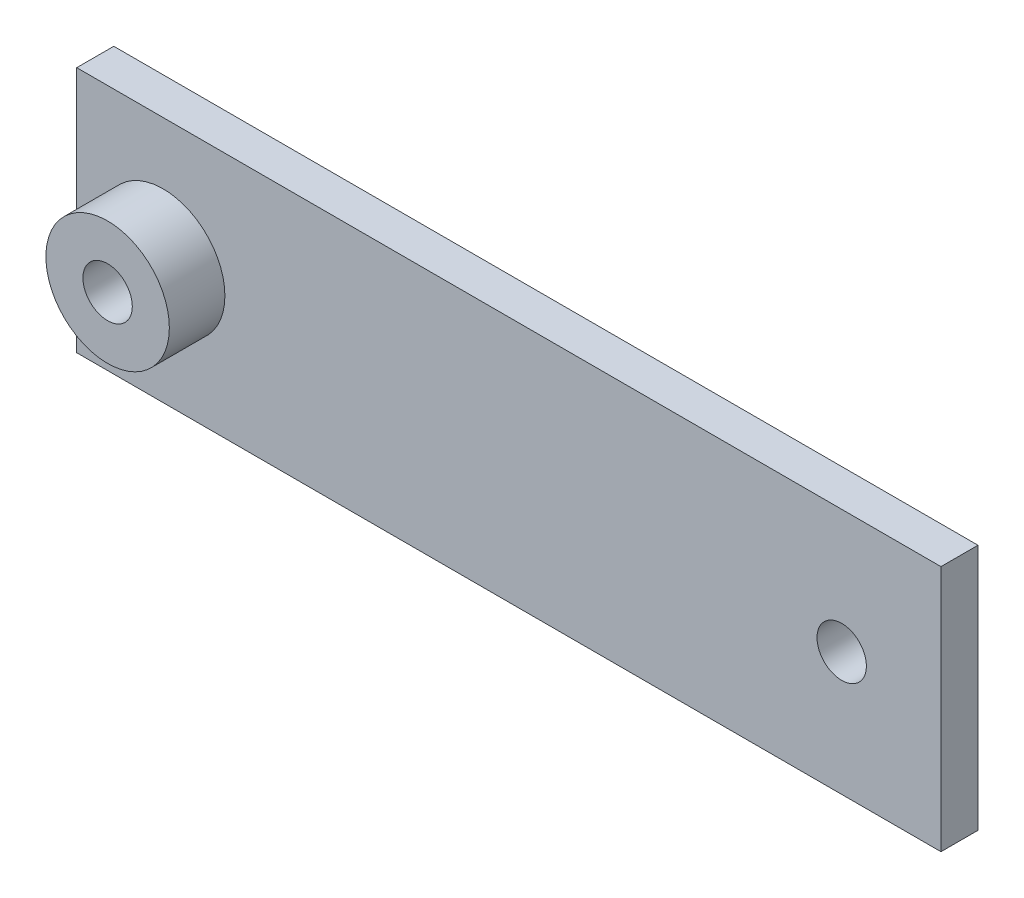
ISO-10303-21;
HEADER;
FILE_DESCRIPTION(('STEP AP214'),'2;1');
FILE_NAME('part.step','',(''),(''),'','','');
FILE_SCHEMA(('AUTOMOTIVE_DESIGN { 1 0 10303 214 1 1 1 1 }'));
ENDSEC;
DATA;
#1=APPLICATION_CONTEXT('core data for automotive mechanical design processes');
#2=APPLICATION_PROTOCOL_DEFINITION('international standard','automotive_design',2000,#1);
#3=PRODUCT_CONTEXT('',#1,'mechanical');
#4=PRODUCT('Part','Part','',(#3));
#5=PRODUCT_RELATED_PRODUCT_CATEGORY('part','',(#4));
#6=PRODUCT_DEFINITION_FORMATION('','',#4);
#7=PRODUCT_DEFINITION_CONTEXT('part definition',#1,'design');
#8=PRODUCT_DEFINITION('design','',#6,#7);
#9=PRODUCT_DEFINITION_SHAPE('','',#8);
#10=(LENGTH_UNIT() NAMED_UNIT(*) SI_UNIT(.MILLI.,.METRE.));
#11=(NAMED_UNIT(*) PLANE_ANGLE_UNIT() SI_UNIT($,.RADIAN.));
#12=(NAMED_UNIT(*) SI_UNIT($,.STERADIAN.) SOLID_ANGLE_UNIT());
#13=UNCERTAINTY_MEASURE_WITH_UNIT(LENGTH_MEASURE(1.E-05),#10,'distance_accuracy_value','');
#14=(GEOMETRIC_REPRESENTATION_CONTEXT(3) GLOBAL_UNCERTAINTY_ASSIGNED_CONTEXT((#13)) GLOBAL_UNIT_ASSIGNED_CONTEXT((#10,
#11,#12)) REPRESENTATION_CONTEXT('',''));
#15=CARTESIAN_POINT('',(0.,0.,0.));
#16=DIRECTION('',(0.,0.,1.));
#17=DIRECTION('',(1.,0.,0.));
#18=AXIS2_PLACEMENT_3D('',#15,#16,#17);
#19=CARTESIAN_POINT('',(35.,10.,3.));
#20=DIRECTION('',(-1.,0.,0.));
#21=DIRECTION('',(0.,0.,1.));
#22=AXIS2_PLACEMENT_3D('',#19,#20,#21);
#23=PLANE('',#22);
#24=DIRECTION('',(0.,1.,0.));
#25=VECTOR('',#24,1.);
#26=CARTESIAN_POINT('',(35.,10.,0.));
#27=LINE('',#26,#25);
#28=CARTESIAN_POINT('',(35.,-10.,0.));
#29=VERTEX_POINT('',#28);
#30=CARTESIAN_POINT('',(35.,10.,0.));
#31=VERTEX_POINT('',#30);
#32=EDGE_CURVE('E97',#29,#31,#27,.T.);
#33=ORIENTED_EDGE('',*,*,#32,.T.);
#34=DIRECTION('',(0.,0.,-1.));
#35=VECTOR('',#34,1.);
#36=CARTESIAN_POINT('',(35.,10.,3.));
#37=LINE('',#36,#35);
#38=CARTESIAN_POINT('',(35.,10.,3.));
#39=VERTEX_POINT('',#38);
#40=EDGE_CURVE('E11',#39,#31,#37,.T.);
#41=ORIENTED_EDGE('',*,*,#40,.F.);
#42=DIRECTION('',(0.,1.,0.));
#43=VECTOR('',#42,1.);
#44=CARTESIAN_POINT('',(35.,10.,3.));
#45=LINE('',#44,#43);
#46=CARTESIAN_POINT('',(35.,-10.,3.));
#47=VERTEX_POINT('',#46);
#48=EDGE_CURVE('E85',#47,#39,#45,.T.);
#49=ORIENTED_EDGE('',*,*,#48,.F.);
#50=DIRECTION('',(0.,0.,-1.));
#51=VECTOR('',#50,1.);
#52=CARTESIAN_POINT('',(35.,-10.,3.));
#53=LINE('',#52,#51);
#54=EDGE_CURVE('E93',#47,#29,#53,.T.);
#55=ORIENTED_EDGE('',*,*,#54,.T.);
#56=EDGE_LOOP('',(#33,#41,#49,#55));
#57=FACE_BOUND('',#56,.T.);
#58=ADVANCED_FACE('F34',(#57),#23,.F.);
#59=CARTESIAN_POINT('',(-35.,10.,3.));
#60=DIRECTION('',(0.,-1.,0.));
#61=DIRECTION('',(0.,0.,-1.));
#62=AXIS2_PLACEMENT_3D('',#59,#60,#61);
#63=PLANE('',#62);
#64=DIRECTION('',(-1.,0.,0.));
#65=VECTOR('',#64,1.);
#66=CARTESIAN_POINT('',(-35.,10.,0.));
#67=LINE('',#66,#65);
#68=CARTESIAN_POINT('',(-35.,10.,0.));
#69=VERTEX_POINT('',#68);
#70=EDGE_CURVE('E89',#31,#69,#67,.T.);
#71=ORIENTED_EDGE('',*,*,#70,.T.);
#72=DIRECTION('',(0.,0.,-1.));
#73=VECTOR('',#72,1.);
#74=CARTESIAN_POINT('',(-35.,10.,3.));
#75=LINE('',#74,#73);
#76=CARTESIAN_POINT('',(-35.,10.,3.));
#77=VERTEX_POINT('',#76);
#78=EDGE_CURVE('E42',#77,#69,#75,.T.);
#79=ORIENTED_EDGE('',*,*,#78,.F.);
#80=DIRECTION('',(-1.,0.,0.));
#81=VECTOR('',#80,1.);
#82=CARTESIAN_POINT('',(-35.,10.,3.));
#83=LINE('',#82,#81);
#84=EDGE_CURVE('E80',#39,#77,#83,.T.);
#85=ORIENTED_EDGE('',*,*,#84,.F.);
#86=ORIENTED_EDGE('',*,*,#40,.T.);
#87=EDGE_LOOP('',(#71,#79,#85,#86));
#88=FACE_BOUND('',#87,.T.);
#89=ADVANCED_FACE('F88',(#88),#63,.F.);
#90=CARTESIAN_POINT('',(-35.,10.,3.));
#91=DIRECTION('',(1.,0.,0.));
#92=DIRECTION('',(0.,0.,-1.));
#93=AXIS2_PLACEMENT_3D('',#90,#91,#92);
#94=PLANE('',#93);
#95=DIRECTION('',(0.,-1.,0.));
#96=VECTOR('',#95,1.);
#97=CARTESIAN_POINT('',(-35.,10.,0.));
#98=LINE('',#97,#96);
#99=CARTESIAN_POINT('',(-35.,-10.,0.));
#100=VERTEX_POINT('',#99);
#101=EDGE_CURVE('E67',#69,#100,#98,.T.);
#102=ORIENTED_EDGE('',*,*,#101,.T.);
#103=DIRECTION('',(0.,0.,-1.));
#104=VECTOR('',#103,1.);
#105=CARTESIAN_POINT('',(-35.,-10.,3.));
#106=LINE('',#105,#104);
#107=CARTESIAN_POINT('',(-35.,-10.,3.));
#108=VERTEX_POINT('',#107);
#109=EDGE_CURVE('E90',#108,#100,#106,.T.);
#110=ORIENTED_EDGE('',*,*,#109,.F.);
#111=DIRECTION('',(0.,-1.,0.));
#112=VECTOR('',#111,1.);
#113=CARTESIAN_POINT('',(-35.,10.,3.));
#114=LINE('',#113,#112);
#115=EDGE_CURVE('E83',#77,#108,#114,.T.);
#116=ORIENTED_EDGE('',*,*,#115,.F.);
#117=ORIENTED_EDGE('',*,*,#78,.T.);
#118=EDGE_LOOP('',(#102,#110,#116,#117));
#119=FACE_BOUND('',#118,.T.);
#120=ADVANCED_FACE('F91',(#119),#94,.F.);
#121=CARTESIAN_POINT('',(-35.,-10.,3.));
#122=DIRECTION('',(0.,1.,0.));
#123=DIRECTION('',(0.,0.,1.));
#124=AXIS2_PLACEMENT_3D('',#121,#122,#123);
#125=PLANE('',#124);
#126=DIRECTION('',(1.,0.,0.));
#127=VECTOR('',#126,1.);
#128=CARTESIAN_POINT('',(-35.,-10.,0.));
#129=LINE('',#128,#127);
#130=EDGE_CURVE('E73',#100,#29,#129,.T.);
#131=ORIENTED_EDGE('',*,*,#130,.T.);
#132=ORIENTED_EDGE('',*,*,#54,.F.);
#133=DIRECTION('',(1.,0.,0.));
#134=VECTOR('',#133,1.);
#135=CARTESIAN_POINT('',(-35.,-10.,3.));
#136=LINE('',#135,#134);
#137=EDGE_CURVE('E50',#108,#47,#136,.T.);
#138=ORIENTED_EDGE('',*,*,#137,.F.);
#139=ORIENTED_EDGE('',*,*,#109,.T.);
#140=EDGE_LOOP('',(#131,#132,#138,#139));
#141=FACE_BOUND('',#140,.T.);
#142=ADVANCED_FACE('F105',(#141),#125,.F.);
#143=CARTESIAN_POINT('',(0.,0.,3.));
#144=DIRECTION('',(0.,0.,1.));
#145=DIRECTION('',(1.,0.,0.));
#146=AXIS2_PLACEMENT_3D('',#143,#144,#145);
#147=PLANE('',#146);
#148=CARTESIAN_POINT('',(-28.,0.,3.));
#149=DIRECTION('',(0.,0.,1.));
#150=DIRECTION('',(1.,0.,0.));
#151=AXIS2_PLACEMENT_3D('',#148,#149,#150);
#152=CIRCLE('',#151,5.);
#153=CARTESIAN_POINT('',(-23.,0.,3.));
#154=VERTEX_POINT('',#153);
#155=EDGE_CURVE('E120',#154,#154,#152,.T.);
#156=ORIENTED_EDGE('',*,*,#155,.F.);
#157=EDGE_LOOP('',(#156));
#158=FACE_BOUND('',#157,.T.);
#159=CARTESIAN_POINT('',(26.96,0.,3.));
#160=DIRECTION('',(0.,0.,1.));
#161=DIRECTION('',(1.,0.,0.));
#162=AXIS2_PLACEMENT_3D('',#159,#160,#161);
#163=CIRCLE('',#162,2.);
#164=CARTESIAN_POINT('',(28.96,0.,3.));
#165=VERTEX_POINT('',#164);
#166=EDGE_CURVE('E111',#165,#165,#163,.T.);
#167=ORIENTED_EDGE('',*,*,#166,.F.);
#168=EDGE_LOOP('',(#167));
#169=FACE_BOUND('',#168,.T.);
#170=ORIENTED_EDGE('',*,*,#48,.T.);
#171=ORIENTED_EDGE('',*,*,#84,.T.);
#172=ORIENTED_EDGE('',*,*,#115,.T.);
#173=ORIENTED_EDGE('',*,*,#137,.T.);
#174=EDGE_LOOP('',(#170,#171,#172,#173));
#175=FACE_BOUND('',#174,.T.);
#176=ADVANCED_FACE('F81',(#158,#169,#175),#147,.T.);
#177=CARTESIAN_POINT('',(0.,0.,0.));
#178=DIRECTION('',(0.,0.,1.));
#179=DIRECTION('',(1.,0.,0.));
#180=AXIS2_PLACEMENT_3D('',#177,#178,#179);
#181=PLANE('',#180);
#182=CARTESIAN_POINT('',(-28.,0.,0.));
#183=DIRECTION('',(0.,0.,1.));
#184=DIRECTION('',(1.,0.,0.));
#185=AXIS2_PLACEMENT_3D('',#182,#183,#184);
#186=CIRCLE('',#185,2.);
#187=CARTESIAN_POINT('',(-26.,0.,0.));
#188=VERTEX_POINT('',#187);
#189=EDGE_CURVE('E100',#188,#188,#186,.T.);
#190=ORIENTED_EDGE('',*,*,#189,.T.);
#191=EDGE_LOOP('',(#190));
#192=FACE_BOUND('',#191,.T.);
#193=CARTESIAN_POINT('',(26.96,0.,0.));
#194=DIRECTION('',(0.,0.,1.));
#195=DIRECTION('',(1.,0.,0.));
#196=AXIS2_PLACEMENT_3D('',#193,#194,#195);
#197=CIRCLE('',#196,2.);
#198=CARTESIAN_POINT('',(28.96,0.,0.));
#199=VERTEX_POINT('',#198);
#200=EDGE_CURVE('E114',#199,#199,#197,.T.);
#201=ORIENTED_EDGE('',*,*,#200,.T.);
#202=EDGE_LOOP('',(#201));
#203=FACE_BOUND('',#202,.T.);
#204=ORIENTED_EDGE('',*,*,#32,.F.);
#205=ORIENTED_EDGE('',*,*,#130,.F.);
#206=ORIENTED_EDGE('',*,*,#101,.F.);
#207=ORIENTED_EDGE('',*,*,#70,.F.);
#208=EDGE_LOOP('',(#204,#205,#206,#207));
#209=FACE_BOUND('',#208,.T.);
#210=ADVANCED_FACE('F108',(#192,#203,#209),#181,.F.);
#211=CARTESIAN_POINT('',(26.96,0.,0.));
#212=DIRECTION('',(0.,0.,1.));
#213=DIRECTION('',(1.,0.,0.));
#214=AXIS2_PLACEMENT_3D('',#211,#212,#213);
#215=CYLINDRICAL_SURFACE('',#214,2.);
#216=ORIENTED_EDGE('',*,*,#200,.F.);
#217=EDGE_LOOP('',(#216));
#218=FACE_BOUND('',#217,.T.);
#219=ORIENTED_EDGE('',*,*,#166,.T.);
#220=EDGE_LOOP('',(#219));
#221=FACE_BOUND('',#220,.T.);
#222=ADVANCED_FACE('F148',(#218,#221),#215,.F.);
#223=CARTESIAN_POINT('',(-28.,0.,0.));
#224=DIRECTION('',(0.,0.,1.));
#225=DIRECTION('',(1.,0.,0.));
#226=AXIS2_PLACEMENT_3D('',#223,#224,#225);
#227=CYLINDRICAL_SURFACE('',#226,2.);
#228=ORIENTED_EDGE('',*,*,#189,.F.);
#229=EDGE_LOOP('',(#228));
#230=FACE_BOUND('',#229,.T.);
#231=CARTESIAN_POINT('',(-28.,0.,7.5));
#232=DIRECTION('',(0.,0.,1.));
#233=DIRECTION('',(1.,0.,0.));
#234=AXIS2_PLACEMENT_3D('',#231,#232,#233);
#235=CIRCLE('',#234,2.);
#236=CARTESIAN_POINT('',(-26.,0.,7.5));
#237=VERTEX_POINT('',#236);
#238=EDGE_CURVE('E123',#237,#237,#235,.T.);
#239=ORIENTED_EDGE('',*,*,#238,.T.);
#240=EDGE_LOOP('',(#239));
#241=FACE_BOUND('',#240,.T.);
#242=ADVANCED_FACE('F129',(#230,#241),#227,.F.);
#243=CARTESIAN_POINT('',(-28.,0.,7.5));
#244=DIRECTION('',(0.,0.,-1.));
#245=DIRECTION('',(-1.,0.,0.));
#246=AXIS2_PLACEMENT_3D('',#243,#244,#245);
#247=CYLINDRICAL_SURFACE('',#246,5.);
#248=CARTESIAN_POINT('',(-28.,0.,7.5));
#249=DIRECTION('',(0.,0.,1.));
#250=DIRECTION('',(1.,0.,0.));
#251=AXIS2_PLACEMENT_3D('',#248,#249,#250);
#252=CIRCLE('',#251,5.);
#253=CARTESIAN_POINT('',(-23.,0.,7.5));
#254=VERTEX_POINT('',#253);
#255=EDGE_CURVE('E115',#254,#254,#252,.T.);
#256=ORIENTED_EDGE('',*,*,#255,.F.);
#257=EDGE_LOOP('',(#256));
#258=FACE_BOUND('',#257,.T.);
#259=ORIENTED_EDGE('',*,*,#155,.T.);
#260=EDGE_LOOP('',(#259));
#261=FACE_BOUND('',#260,.T.);
#262=ADVANCED_FACE('F134',(#258,#261),#247,.T.);
#263=CARTESIAN_POINT('',(-28.,0.,7.5));
#264=DIRECTION('',(0.,0.,1.));
#265=DIRECTION('',(1.,0.,0.));
#266=AXIS2_PLACEMENT_3D('',#263,#264,#265);
#267=PLANE('',#266);
#268=ORIENTED_EDGE('',*,*,#238,.F.);
#269=EDGE_LOOP('',(#268));
#270=FACE_BOUND('',#269,.T.);
#271=ORIENTED_EDGE('',*,*,#255,.T.);
#272=EDGE_LOOP('',(#271));
#273=FACE_BOUND('',#272,.T.);
#274=ADVANCED_FACE('F131',(#270,#273),#267,.T.);
#275=CLOSED_SHELL('',(#58,#89,#120,#142,#176,#210,#222,#242,#262,#274));
#276=MANIFOLD_SOLID_BREP('B2',#275);
#277=ADVANCED_BREP_SHAPE_REPRESENTATION('',(#18,#276),#14);
#278=SHAPE_DEFINITION_REPRESENTATION(#9,#277);
ENDSEC;
END-ISO-10303-21;
